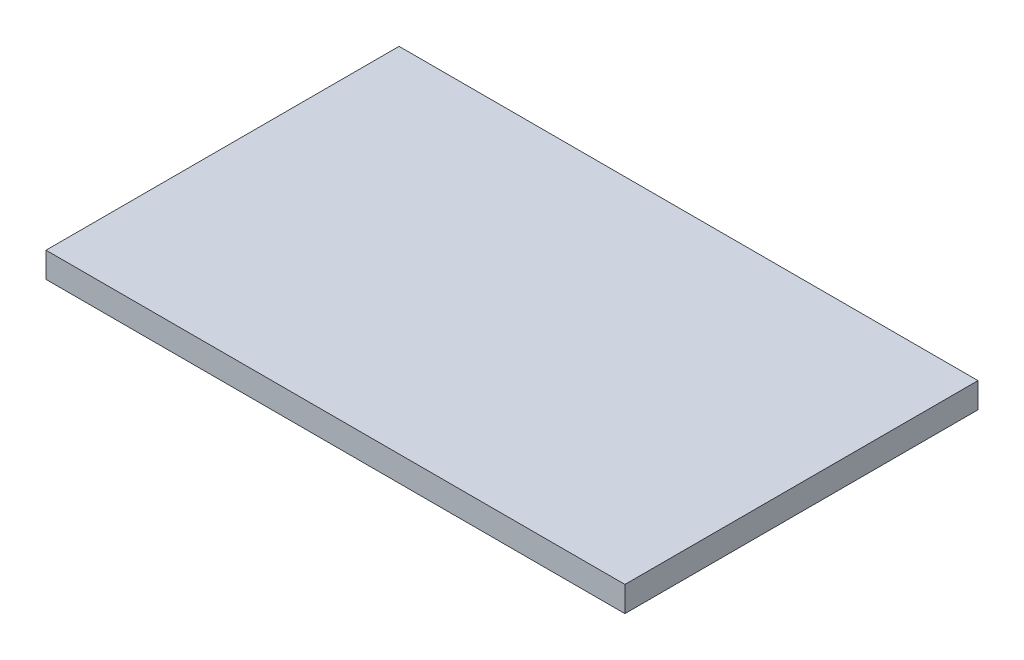
ISO-10303-21;
HEADER;
FILE_DESCRIPTION(('STEP AP214'),'2;1');
FILE_NAME('part.step','',(''),(''),'','','');
FILE_SCHEMA(('AUTOMOTIVE_DESIGN { 1 0 10303 214 1 1 1 1 }'));
ENDSEC;
DATA;
#1=APPLICATION_CONTEXT('core data for automotive mechanical design processes');
#2=APPLICATION_PROTOCOL_DEFINITION('international standard','automotive_design',2000,#1);
#3=PRODUCT_CONTEXT('',#1,'mechanical');
#4=PRODUCT('Part','Part','',(#3));
#5=PRODUCT_RELATED_PRODUCT_CATEGORY('part','',(#4));
#6=PRODUCT_DEFINITION_FORMATION('','',#4);
#7=PRODUCT_DEFINITION_CONTEXT('part definition',#1,'design');
#8=PRODUCT_DEFINITION('design','',#6,#7);
#9=PRODUCT_DEFINITION_SHAPE('','',#8);
#10=(LENGTH_UNIT() NAMED_UNIT(*) SI_UNIT(.MILLI.,.METRE.));
#11=(NAMED_UNIT(*) PLANE_ANGLE_UNIT() SI_UNIT($,.RADIAN.));
#12=(NAMED_UNIT(*) SI_UNIT($,.STERADIAN.) SOLID_ANGLE_UNIT());
#13=UNCERTAINTY_MEASURE_WITH_UNIT(LENGTH_MEASURE(1.E-05),#10,'distance_accuracy_value','');
#14=(GEOMETRIC_REPRESENTATION_CONTEXT(3) GLOBAL_UNCERTAINTY_ASSIGNED_CONTEXT((#13)) GLOBAL_UNIT_ASSIGNED_CONTEXT((#10,
#11,#12)) REPRESENTATION_CONTEXT('',''));
#15=CARTESIAN_POINT('',(0.,0.,0.));
#16=DIRECTION('',(0.,0.,1.));
#17=DIRECTION('',(1.,0.,0.));
#18=AXIS2_PLACEMENT_3D('',#15,#16,#17);
#19=CARTESIAN_POINT('',(-43.29,3.9,-27.2));
#20=DIRECTION('',(1.,0.,0.));
#21=DIRECTION('',(0.,0.,-1.));
#22=AXIS2_PLACEMENT_3D('',#19,#20,#21);
#23=PLANE('',#22);
#24=DIRECTION('',(0.,0.,1.));
#25=VECTOR('',#24,1.);
#26=CARTESIAN_POINT('',(-43.29,0.,-27.2));
#27=LINE('',#26,#25);
#28=CARTESIAN_POINT('',(-43.29,0.,-27.2));
#29=VERTEX_POINT('',#28);
#30=CARTESIAN_POINT('',(-43.29,0.,27.2));
#31=VERTEX_POINT('',#30);
#32=EDGE_CURVE('E116',#29,#31,#27,.T.);
#33=ORIENTED_EDGE('',*,*,#32,.T.);
#34=DIRECTION('',(0.,-1.,0.));
#35=VECTOR('',#34,1.);
#36=CARTESIAN_POINT('',(-43.29,3.9,27.2));
#37=LINE('',#36,#35);
#38=CARTESIAN_POINT('',(-43.29,3.9,27.2));
#39=VERTEX_POINT('',#38);
#40=EDGE_CURVE('E12',#39,#31,#37,.T.);
#41=ORIENTED_EDGE('',*,*,#40,.F.);
#42=DIRECTION('',(0.,0.,1.));
#43=VECTOR('',#42,1.);
#44=CARTESIAN_POINT('',(-43.29,3.9,-27.2));
#45=LINE('',#44,#43);
#46=CARTESIAN_POINT('',(-43.29,3.9,-27.2));
#47=VERTEX_POINT('',#46);
#48=EDGE_CURVE('E104',#47,#39,#45,.T.);
#49=ORIENTED_EDGE('',*,*,#48,.F.);
#50=DIRECTION('',(0.,-1.,0.));
#51=VECTOR('',#50,1.);
#52=CARTESIAN_POINT('',(-43.29,3.9,-27.2));
#53=LINE('',#52,#51);
#54=EDGE_CURVE('E112',#47,#29,#53,.T.);
#55=ORIENTED_EDGE('',*,*,#54,.T.);
#56=EDGE_LOOP('',(#33,#41,#49,#55));
#57=FACE_BOUND('',#56,.T.);
#58=ADVANCED_FACE('F53',(#57),#23,.F.);
#59=CARTESIAN_POINT('',(-43.29,3.9,27.2));
#60=DIRECTION('',(0.,0.,-1.));
#61=DIRECTION('',(-1.,0.,0.));
#62=AXIS2_PLACEMENT_3D('',#59,#60,#61);
#63=PLANE('',#62);
#64=DIRECTION('',(1.,0.,0.));
#65=VECTOR('',#64,1.);
#66=CARTESIAN_POINT('',(-43.29,0.,27.2));
#67=LINE('',#66,#65);
#68=CARTESIAN_POINT('',(45.91,0.,27.2));
#69=VERTEX_POINT('',#68);
#70=EDGE_CURVE('E108',#31,#69,#67,.T.);
#71=ORIENTED_EDGE('',*,*,#70,.T.);
#72=DIRECTION('',(0.,-1.,0.));
#73=VECTOR('',#72,1.);
#74=CARTESIAN_POINT('',(45.91,3.9,27.2));
#75=LINE('',#74,#73);
#76=CARTESIAN_POINT('',(45.91,3.9,27.2));
#77=VERTEX_POINT('',#76);
#78=EDGE_CURVE('E61',#77,#69,#75,.T.);
#79=ORIENTED_EDGE('',*,*,#78,.F.);
#80=DIRECTION('',(1.,0.,0.));
#81=VECTOR('',#80,1.);
#82=CARTESIAN_POINT('',(-43.29,3.9,27.2));
#83=LINE('',#82,#81);
#84=EDGE_CURVE('E99',#39,#77,#83,.T.);
#85=ORIENTED_EDGE('',*,*,#84,.F.);
#86=ORIENTED_EDGE('',*,*,#40,.T.);
#87=EDGE_LOOP('',(#71,#79,#85,#86));
#88=FACE_BOUND('',#87,.T.);
#89=ADVANCED_FACE('F107',(#88),#63,.F.);
#90=CARTESIAN_POINT('',(45.91,3.9,-27.2));
#91=DIRECTION('',(-1.,0.,0.));
#92=DIRECTION('',(0.,0.,1.));
#93=AXIS2_PLACEMENT_3D('',#90,#91,#92);
#94=PLANE('',#93);
#95=DIRECTION('',(0.,0.,-1.));
#96=VECTOR('',#95,1.);
#97=CARTESIAN_POINT('',(45.91,0.,-27.2));
#98=LINE('',#97,#96);
#99=CARTESIAN_POINT('',(45.91,0.,-27.2));
#100=VERTEX_POINT('',#99);
#101=EDGE_CURVE('E86',#69,#100,#98,.T.);
#102=ORIENTED_EDGE('',*,*,#101,.T.);
#103=DIRECTION('',(0.,-1.,0.));
#104=VECTOR('',#103,1.);
#105=CARTESIAN_POINT('',(45.91,3.9,-27.2));
#106=LINE('',#105,#104);
#107=CARTESIAN_POINT('',(45.91,3.9,-27.2));
#108=VERTEX_POINT('',#107);
#109=EDGE_CURVE('E109',#108,#100,#106,.T.);
#110=ORIENTED_EDGE('',*,*,#109,.F.);
#111=DIRECTION('',(0.,0.,-1.));
#112=VECTOR('',#111,1.);
#113=CARTESIAN_POINT('',(45.91,3.9,-27.2));
#114=LINE('',#113,#112);
#115=EDGE_CURVE('E102',#77,#108,#114,.T.);
#116=ORIENTED_EDGE('',*,*,#115,.F.);
#117=ORIENTED_EDGE('',*,*,#78,.T.);
#118=EDGE_LOOP('',(#102,#110,#116,#117));
#119=FACE_BOUND('',#118,.T.);
#120=ADVANCED_FACE('F110',(#119),#94,.F.);
#121=CARTESIAN_POINT('',(-43.29,3.9,-27.2));
#122=DIRECTION('',(0.,0.,1.));
#123=DIRECTION('',(1.,0.,0.));
#124=AXIS2_PLACEMENT_3D('',#121,#122,#123);
#125=PLANE('',#124);
#126=DIRECTION('',(-1.,0.,0.));
#127=VECTOR('',#126,1.);
#128=CARTESIAN_POINT('',(-43.29,0.,-27.2));
#129=LINE('',#128,#127);
#130=EDGE_CURVE('E92',#100,#29,#129,.T.);
#131=ORIENTED_EDGE('',*,*,#130,.T.);
#132=ORIENTED_EDGE('',*,*,#54,.F.);
#133=DIRECTION('',(-1.,0.,0.));
#134=VECTOR('',#133,1.);
#135=CARTESIAN_POINT('',(-43.29,3.9,-27.2));
#136=LINE('',#135,#134);
#137=EDGE_CURVE('E69',#108,#47,#136,.T.);
#138=ORIENTED_EDGE('',*,*,#137,.F.);
#139=ORIENTED_EDGE('',*,*,#109,.T.);
#140=EDGE_LOOP('',(#131,#132,#138,#139));
#141=FACE_BOUND('',#140,.T.);
#142=ADVANCED_FACE('F123',(#141),#125,.F.);
#143=CARTESIAN_POINT('',(0.,3.9,0.));
#144=DIRECTION('',(0.,1.,0.));
#145=DIRECTION('',(0.,0.,1.));
#146=AXIS2_PLACEMENT_3D('',#143,#144,#145);
#147=PLANE('',#146);
#148=ORIENTED_EDGE('',*,*,#48,.T.);
#149=ORIENTED_EDGE('',*,*,#84,.T.);
#150=ORIENTED_EDGE('',*,*,#115,.T.);
#151=ORIENTED_EDGE('',*,*,#137,.T.);
#152=EDGE_LOOP('',(#148,#149,#150,#151));
#153=FACE_BOUND('',#152,.T.);
#154=ADVANCED_FACE('F100',(#153),#147,.T.);
#155=CARTESIAN_POINT('',(0.,0.,0.));
#156=DIRECTION('',(0.,1.,0.));
#157=DIRECTION('',(0.,0.,1.));
#158=AXIS2_PLACEMENT_3D('',#155,#156,#157);
#159=PLANE('',#158);
#160=ORIENTED_EDGE('',*,*,#32,.F.);
#161=ORIENTED_EDGE('',*,*,#130,.F.);
#162=ORIENTED_EDGE('',*,*,#101,.F.);
#163=ORIENTED_EDGE('',*,*,#70,.F.);
#164=EDGE_LOOP('',(#160,#161,#162,#163));
#165=FACE_BOUND('',#164,.T.);
#166=ADVANCED_FACE('F126',(#165),#159,.F.);
#167=CLOSED_SHELL('',(#58,#89,#120,#142,#154,#166));
#168=MANIFOLD_SOLID_BREP('B2_NOT_SHOWN',#167);
#169=CARTESIAN_POINT('',(-44.82186966203,-4.,20.));
#170=DIRECTION('',(0.,0.,-1.));
#171=DIRECTION('',(-1.,0.,0.));
#172=AXIS2_PLACEMENT_3D('',#169,#170,#171);
#173=CYLINDRICAL_SURFACE('',#172,2.7);
#174=CARTESIAN_POINT('',(-44.82186966203,-4.,-20.));
#175=DIRECTION('',(0.,0.,-1.));
#176=DIRECTION('',(1.,0.,0.));
#177=AXIS2_PLACEMENT_3D('',#174,#175,#176);
#178=CIRCLE('',#177,2.7);
#179=CARTESIAN_POINT('',(-46.5681498024083,-6.05924881238775,-20.));
#180=VERTEX_POINT('',#179);
#181=CARTESIAN_POINT('',(-43.0755895216517,-6.05924881238776,-20.));
#182=VERTEX_POINT('',#181);
#183=EDGE_CURVE('E260',#180,#182,#178,.T.);
#184=ORIENTED_EDGE('',*,*,#183,.T.);
#185=DIRECTION('',(0.,0.,-1.));
#186=VECTOR('',#185,1.);
#187=CARTESIAN_POINT('',(-43.0755895216517,-6.05924881238776,20.));
#188=LINE('',#187,#186);
#189=CARTESIAN_POINT('',(-43.0755895216517,-6.05924881238776,20.));
#190=VERTEX_POINT('',#189);
#191=EDGE_CURVE('E198',#182,#190,#188,.F.);
#192=ORIENTED_EDGE('',*,*,#191,.T.);
#193=CARTESIAN_POINT('',(-44.82186966203,-4.,20.));
#194=DIRECTION('',(0.,0.,-1.));
#195=DIRECTION('',(1.,0.,0.));
#196=AXIS2_PLACEMENT_3D('',#193,#194,#195);
#197=CIRCLE('',#196,2.7);
#198=CARTESIAN_POINT('',(-46.5681498024083,-6.05924881238775,20.));
#199=VERTEX_POINT('',#198);
#200=EDGE_CURVE('E241',#199,#190,#197,.T.);
#201=ORIENTED_EDGE('',*,*,#200,.F.);
#202=DIRECTION('',(0.,0.,-1.));
#203=VECTOR('',#202,1.);
#204=CARTESIAN_POINT('',(-46.5681498024083,-6.05924881238775,20.));
#205=LINE('',#204,#203);
#206=EDGE_CURVE('E273',#199,#180,#205,.T.);
#207=ORIENTED_EDGE('',*,*,#206,.T.);
#208=EDGE_LOOP('',(#184,#192,#201,#207));
#209=FACE_BOUND('',#208,.T.);
#210=ADVANCED_FACE('F177',(#209),#173,.F.);
#211=CARTESIAN_POINT('',(-43.80186966203,-6.49991999871996,20.));
#212=DIRECTION('',(0.,1.,0.));
#213=DIRECTION('',(-1.,0.,0.));
#214=AXIS2_PLACEMENT_3D('',#211,#212,#213);
#215=PLANE('',#214);
#216=DIRECTION('',(1.,0.,0.));
#217=VECTOR('',#216,1.);
#218=CARTESIAN_POINT('',(-43.80186966203,-6.49991999871996,20.));
#219=LINE('',#218,#217);
#220=CARTESIAN_POINT('',(-42.9138969160611,-6.49991999871996,20.));
#221=VERTEX_POINT('',#220);
#222=CARTESIAN_POINT('',(-41.828476938046,-6.49991999871996,20.));
#223=VERTEX_POINT('',#222);
#224=EDGE_CURVE('E231',#221,#223,#219,.T.);
#225=ORIENTED_EDGE('',*,*,#224,.F.);
#226=DIRECTION('',(0.,0.,-1.));
#227=VECTOR('',#226,1.);
#228=CARTESIAN_POINT('',(-42.9138969160611,-6.49991999871996,20.));
#229=LINE('',#228,#227);
#230=CARTESIAN_POINT('',(-42.9138969160611,-6.49991999871996,-20.));
#231=VERTEX_POINT('',#230);
#232=EDGE_CURVE('E250',#221,#231,#229,.T.);
#233=ORIENTED_EDGE('',*,*,#232,.T.);
#234=DIRECTION('',(1.,0.,0.));
#235=VECTOR('',#234,1.);
#236=CARTESIAN_POINT('',(-43.80186966203,-6.49991999871996,-20.));
#237=LINE('',#236,#235);
#238=CARTESIAN_POINT('',(-41.828476938046,-6.49991999871996,-20.));
#239=VERTEX_POINT('',#238);
#240=EDGE_CURVE('E247',#231,#239,#237,.T.);
#241=ORIENTED_EDGE('',*,*,#240,.T.);
#242=DIRECTION('',(0.,0.,-1.));
#243=VECTOR('',#242,1.);
#244=CARTESIAN_POINT('',(-41.828476938046,-6.49991999871996,20.));
#245=LINE('',#244,#243);
#246=EDGE_CURVE('E244',#223,#239,#245,.T.);
#247=ORIENTED_EDGE('',*,*,#246,.F.);
#248=EDGE_LOOP('',(#225,#233,#241,#247));
#249=FACE_BOUND('',#248,.T.);
#250=ADVANCED_FACE('F245',(#249),#215,.F.);
#251=CARTESIAN_POINT('',(-44.82186966203,-4.,20.));
#252=DIRECTION('',(0.,0.,-1.));
#253=DIRECTION('',(-1.,0.,0.));
#254=AXIS2_PLACEMENT_3D('',#251,#252,#253);
#255=CYLINDRICAL_SURFACE('',#254,3.9);
#256=CARTESIAN_POINT('',(-44.82186966203,-4.,-20.));
#257=DIRECTION('',(0.,0.,1.));
#258=DIRECTION('',(1.,0.,0.));
#259=AXIS2_PLACEMENT_3D('',#256,#257,#258);
#260=CIRCLE('',#259,3.9);
#261=CARTESIAN_POINT('',(-47.8152623860139,-6.49991999871995,-20.));
#262=VERTEX_POINT('',#261);
#263=EDGE_CURVE('E263',#239,#262,#260,.T.);
#264=ORIENTED_EDGE('',*,*,#263,.T.);
#265=DIRECTION('',(0.,0.,-1.));
#266=VECTOR('',#265,1.);
#267=CARTESIAN_POINT('',(-47.8152623860139,-6.49991999871995,20.));
#268=LINE('',#267,#266);
#269=CARTESIAN_POINT('',(-47.8152623860139,-6.49991999871995,20.));
#270=VERTEX_POINT('',#269);
#271=EDGE_CURVE('E251',#270,#262,#268,.T.);
#272=ORIENTED_EDGE('',*,*,#271,.F.);
#273=CARTESIAN_POINT('',(-44.82186966203,-4.,20.));
#274=DIRECTION('',(0.,0.,1.));
#275=DIRECTION('',(1.,0.,0.));
#276=AXIS2_PLACEMENT_3D('',#273,#274,#275);
#277=CIRCLE('',#276,3.9);
#278=EDGE_CURVE('E235',#223,#270,#277,.T.);
#279=ORIENTED_EDGE('',*,*,#278,.F.);
#280=ORIENTED_EDGE('',*,*,#246,.T.);
#281=EDGE_LOOP('',(#264,#272,#279,#280));
#282=FACE_BOUND('',#281,.T.);
#283=ADVANCED_FACE('F253',(#282),#255,.T.);
#284=CARTESIAN_POINT('',(-47.8152623860139,-6.49991999871995,20.));
#285=DIRECTION('',(0.,1.,0.));
#286=DIRECTION('',(0.,0.,1.));
#287=AXIS2_PLACEMENT_3D('',#284,#285,#286);
#288=PLANE('',#287);
#289=DIRECTION('',(1.,0.,0.));
#290=VECTOR('',#289,1.);
#291=CARTESIAN_POINT('',(-47.8152623860139,-6.49991999871995,-20.));
#292=LINE('',#291,#290);
#293=CARTESIAN_POINT('',(-46.7298424079988,-6.49991999871995,-20.));
#294=VERTEX_POINT('',#293);
#295=EDGE_CURVE('E265',#262,#294,#292,.T.);
#296=ORIENTED_EDGE('',*,*,#295,.T.);
#297=DIRECTION('',(0.,0.,-1.));
#298=VECTOR('',#297,1.);
#299=CARTESIAN_POINT('',(-46.7298424079988,-6.49991999871995,20.));
#300=LINE('',#299,#298);
#301=CARTESIAN_POINT('',(-46.7298424079988,-6.49991999871995,20.));
#302=VERTEX_POINT('',#301);
#303=EDGE_CURVE('E51',#294,#302,#300,.F.);
#304=ORIENTED_EDGE('',*,*,#303,.T.);
#305=DIRECTION('',(1.,0.,0.));
#306=VECTOR('',#305,1.);
#307=CARTESIAN_POINT('',(-47.8152623860139,-6.49991999871995,20.));
#308=LINE('',#307,#306);
#309=EDGE_CURVE('E255',#270,#302,#308,.T.);
#310=ORIENTED_EDGE('',*,*,#309,.F.);
#311=ORIENTED_EDGE('',*,*,#271,.T.);
#312=EDGE_LOOP('',(#296,#304,#310,#311));
#313=FACE_BOUND('',#312,.T.);
#314=ADVANCED_FACE('F285',(#313),#288,.F.);
#315=CARTESIAN_POINT('',(-44.82186966203,-4.,20.));
#316=DIRECTION('',(0.,0.,1.));
#317=DIRECTION('',(1.,0.,0.));
#318=AXIS2_PLACEMENT_3D('',#315,#316,#317);
#319=PLANE('',#318);
#320=ORIENTED_EDGE('',*,*,#200,.T.);
#321=CARTESIAN_POINT('',(-42.9138969160611,-6.24991999871996,20.));
#322=DIRECTION('',(0.,0.,1.));
#323=DIRECTION('',(1.,0.,0.));
#324=AXIS2_PLACEMENT_3D('',#321,#322,#323);
#325=CIRCLE('',#324,0.25);
#326=EDGE_CURVE('E185',#190,#221,#325,.T.);
#327=ORIENTED_EDGE('',*,*,#326,.T.);
#328=ORIENTED_EDGE('',*,*,#224,.T.);
#329=ORIENTED_EDGE('',*,*,#278,.T.);
#330=ORIENTED_EDGE('',*,*,#309,.T.);
#331=CARTESIAN_POINT('',(-46.7298424079988,-6.24991999871995,20.));
#332=DIRECTION('',(0.,0.,1.));
#333=DIRECTION('',(1.,0.,0.));
#334=AXIS2_PLACEMENT_3D('',#331,#332,#333);
#335=CIRCLE('',#334,0.25);
#336=EDGE_CURVE('E277',#302,#199,#335,.T.);
#337=ORIENTED_EDGE('',*,*,#336,.T.);
#338=EDGE_LOOP('',(#320,#327,#328,#329,#330,#337));
#339=FACE_BOUND('',#338,.T.);
#340=ADVANCED_FACE('F233',(#339),#319,.T.);
#341=CARTESIAN_POINT('',(-44.82186966203,-4.,-20.));
#342=DIRECTION('',(0.,0.,1.));
#343=DIRECTION('',(1.,0.,0.));
#344=AXIS2_PLACEMENT_3D('',#341,#342,#343);
#345=PLANE('',#344);
#346=ORIENTED_EDGE('',*,*,#240,.F.);
#347=CARTESIAN_POINT('',(-42.9138969160611,-6.24991999871996,-20.));
#348=DIRECTION('',(0.,0.,1.));
#349=DIRECTION('',(1.,0.,0.));
#350=AXIS2_PLACEMENT_3D('',#347,#348,#349);
#351=CIRCLE('',#350,0.25);
#352=EDGE_CURVE('E271',#231,#182,#351,.F.);
#353=ORIENTED_EDGE('',*,*,#352,.T.);
#354=ORIENTED_EDGE('',*,*,#183,.F.);
#355=CARTESIAN_POINT('',(-46.7298424079988,-6.24991999871995,-20.));
#356=DIRECTION('',(0.,0.,1.));
#357=DIRECTION('',(1.,0.,0.));
#358=AXIS2_PLACEMENT_3D('',#355,#356,#357);
#359=CIRCLE('',#358,0.25);
#360=EDGE_CURVE('E269',#180,#294,#359,.F.);
#361=ORIENTED_EDGE('',*,*,#360,.T.);
#362=ORIENTED_EDGE('',*,*,#295,.F.);
#363=ORIENTED_EDGE('',*,*,#263,.F.);
#364=EDGE_LOOP('',(#346,#353,#354,#361,#362,#363));
#365=FACE_BOUND('',#364,.T.);
#366=ADVANCED_FACE('F284',(#365),#345,.F.);
#367=CARTESIAN_POINT('',(-42.9138969160611,-6.24991999871996,20.));
#368=DIRECTION('',(0.,0.,-1.));
#369=DIRECTION('',(-1.,0.,0.));
#370=AXIS2_PLACEMENT_3D('',#367,#368,#369);
#371=CYLINDRICAL_SURFACE('',#370,0.25);
#372=ORIENTED_EDGE('',*,*,#326,.F.);
#373=ORIENTED_EDGE('',*,*,#191,.F.);
#374=ORIENTED_EDGE('',*,*,#352,.F.);
#375=ORIENTED_EDGE('',*,*,#232,.F.);
#376=EDGE_LOOP('',(#372,#373,#374,#375));
#377=FACE_BOUND('',#376,.T.);
#378=ADVANCED_FACE('F301',(#377),#371,.T.);
#379=CARTESIAN_POINT('',(-46.7298424079988,-6.24991999871995,20.));
#380=DIRECTION('',(0.,0.,-1.));
#381=DIRECTION('',(-1.,0.,0.));
#382=AXIS2_PLACEMENT_3D('',#379,#380,#381);
#383=CYLINDRICAL_SURFACE('',#382,0.25);
#384=ORIENTED_EDGE('',*,*,#336,.F.);
#385=ORIENTED_EDGE('',*,*,#303,.F.);
#386=ORIENTED_EDGE('',*,*,#360,.F.);
#387=ORIENTED_EDGE('',*,*,#206,.F.);
#388=EDGE_LOOP('',(#384,#385,#386,#387));
#389=FACE_BOUND('',#388,.T.);
#390=ADVANCED_FACE('F179',(#389),#383,.T.);
#391=CLOSED_SHELL('',(#210,#250,#283,#314,#340,#366,#378,#390));
#392=MANIFOLD_SOLID_BREP('B6',#391);
#393=ADVANCED_BREP_SHAPE_REPRESENTATION('',(#18,#168,#392),#14);
#394=SHAPE_DEFINITION_REPRESENTATION(#9,#393);
ENDSEC;
END-ISO-10303-21;
